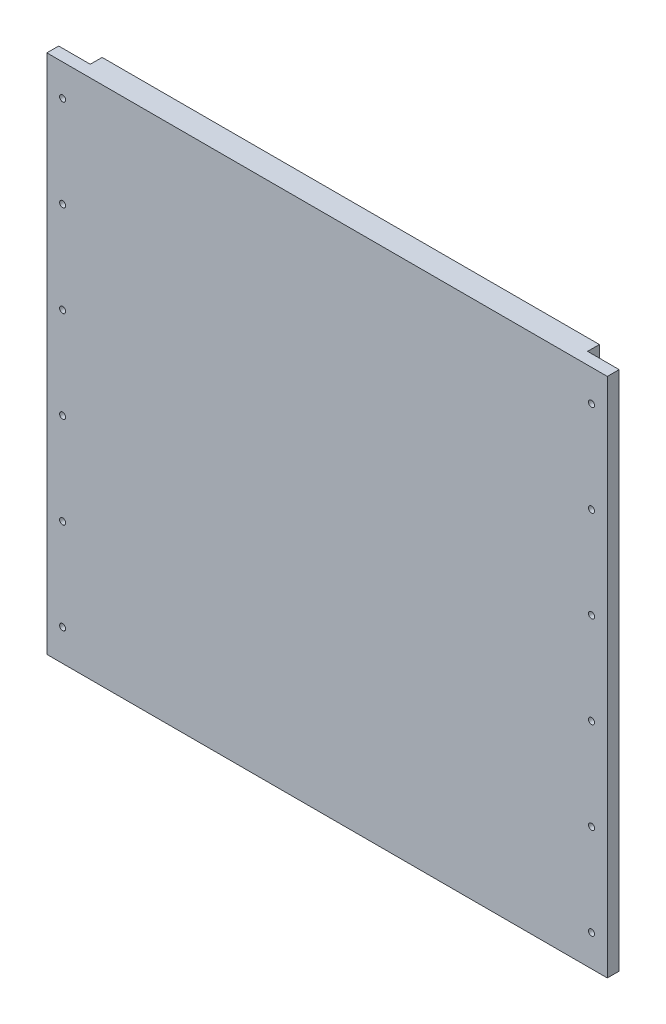
ISO-10303-21;
HEADER;
FILE_DESCRIPTION(('STEP AP214'),'2;1');
FILE_NAME('part.step','',(''),(''),'','','');
FILE_SCHEMA(('AUTOMOTIVE_DESIGN { 1 0 10303 214 1 1 1 1 }'));
ENDSEC;
DATA;
#1=APPLICATION_CONTEXT('core data for automotive mechanical design processes');
#2=APPLICATION_PROTOCOL_DEFINITION('international standard','automotive_design',2000,#1);
#3=PRODUCT_CONTEXT('',#1,'mechanical');
#4=PRODUCT('Part','Part','',(#3));
#5=PRODUCT_RELATED_PRODUCT_CATEGORY('part','',(#4));
#6=PRODUCT_DEFINITION_FORMATION('','',#4);
#7=PRODUCT_DEFINITION_CONTEXT('part definition',#1,'design');
#8=PRODUCT_DEFINITION('design','',#6,#7);
#9=PRODUCT_DEFINITION_SHAPE('','',#8);
#10=(LENGTH_UNIT() NAMED_UNIT(*) SI_UNIT(.MILLI.,.METRE.));
#11=(NAMED_UNIT(*) PLANE_ANGLE_UNIT() SI_UNIT($,.RADIAN.));
#12=(NAMED_UNIT(*) SI_UNIT($,.STERADIAN.) SOLID_ANGLE_UNIT());
#13=UNCERTAINTY_MEASURE_WITH_UNIT(LENGTH_MEASURE(1.E-05),#10,'distance_accuracy_value','');
#14=(GEOMETRIC_REPRESENTATION_CONTEXT(3) GLOBAL_UNCERTAINTY_ASSIGNED_CONTEXT((#13)) GLOBAL_UNIT_ASSIGNED_CONTEXT((#10,
#11,#12)) REPRESENTATION_CONTEXT('',''));
#15=CARTESIAN_POINT('',(0.,0.,0.));
#16=DIRECTION('',(0.,0.,1.));
#17=DIRECTION('',(1.,0.,0.));
#18=AXIS2_PLACEMENT_3D('',#15,#16,#17);
#19=CARTESIAN_POINT('',(-17.1701871411068,419.1,-1.02027368141359));
#20=DIRECTION('',(1.,0.,0.));
#21=DIRECTION('',(0.,0.,-1.));
#22=AXIS2_PLACEMENT_3D('',#19,#20,#21);
#23=PLANE('',#22);
#24=DIRECTION('',(0.,0.,1.));
#25=VECTOR('',#24,1.);
#26=CARTESIAN_POINT('',(-17.1701871411068,0.,-1.02027368141359));
#27=LINE('',#26,#25);
#28=CARTESIAN_POINT('',(-17.1701871411068,0.,-1.02027368141359));
#29=VERTEX_POINT('',#28);
#30=CARTESIAN_POINT('',(-17.1701871411068,0.,8.50472631858641));
#31=VERTEX_POINT('',#30);
#32=EDGE_CURVE('E131',#29,#31,#27,.T.);
#33=ORIENTED_EDGE('',*,*,#32,.T.);
#34=DIRECTION('',(0.,-1.,0.));
#35=VECTOR('',#34,1.);
#36=CARTESIAN_POINT('',(-17.1701871411068,419.1,8.50472631858641));
#37=LINE('',#36,#35);
#38=CARTESIAN_POINT('',(-17.1701871411068,419.1,8.50472631858641));
#39=VERTEX_POINT('',#38);
#40=EDGE_CURVE('E11',#39,#31,#37,.T.);
#41=ORIENTED_EDGE('',*,*,#40,.F.);
#42=DIRECTION('',(0.,0.,1.));
#43=VECTOR('',#42,1.);
#44=CARTESIAN_POINT('',(-17.1701871411068,419.1,-1.02027368141359));
#45=LINE('',#44,#43);
#46=CARTESIAN_POINT('',(-17.1701871411068,419.1,-1.02027368141359));
#47=VERTEX_POINT('',#46);
#48=EDGE_CURVE('E147',#47,#39,#45,.T.);
#49=ORIENTED_EDGE('',*,*,#48,.F.);
#50=DIRECTION('',(0.,-1.,0.));
#51=VECTOR('',#50,1.);
#52=CARTESIAN_POINT('',(-17.1701871411068,419.1,-1.02027368141359));
#53=LINE('',#52,#51);
#54=EDGE_CURVE('E127',#47,#29,#53,.T.);
#55=ORIENTED_EDGE('',*,*,#54,.T.);
#56=EDGE_LOOP('',(#33,#41,#49,#55));
#57=FACE_BOUND('',#56,.T.);
#58=ADVANCED_FACE('F33',(#57),#23,.F.);
#59=CARTESIAN_POINT('',(-17.1701871411068,419.1,8.50472631858641));
#60=DIRECTION('',(0.,0.,1.));
#61=DIRECTION('',(1.,0.,0.));
#62=AXIS2_PLACEMENT_3D('',#59,#60,#61);
#63=PLANE('',#62);
#64=CARTESIAN_POINT('',(-29.8701871411068,393.7,8.50472631858642));
#65=DIRECTION('',(0.,0.,1.));
#66=DIRECTION('',(1.,0.,0.));
#67=AXIS2_PLACEMENT_3D('',#64,#65,#66);
#68=CIRCLE('',#67,2.45744999999999);
#69=CARTESIAN_POINT('',(-27.4127371411068,393.7,8.50472631858642));
#70=VERTEX_POINT('',#69);
#71=EDGE_CURVE('E309',#70,#70,#68,.T.);
#72=ORIENTED_EDGE('',*,*,#71,.T.);
#73=EDGE_LOOP('',(#72));
#74=FACE_BOUND('',#73,.T.);
#75=CARTESIAN_POINT('',(-29.8701871411068,320.04,8.50472631858642));
#76=DIRECTION('',(0.,0.,1.));
#77=DIRECTION('',(1.,0.,0.));
#78=AXIS2_PLACEMENT_3D('',#75,#76,#77);
#79=CIRCLE('',#78,2.45744999999999);
#80=CARTESIAN_POINT('',(-27.4127371411068,320.04,8.50472631858642));
#81=VERTEX_POINT('',#80);
#82=EDGE_CURVE('E313',#81,#81,#79,.T.);
#83=ORIENTED_EDGE('',*,*,#82,.T.);
#84=EDGE_LOOP('',(#83));
#85=FACE_BOUND('',#84,.T.);
#86=CARTESIAN_POINT('',(-29.8701871411068,246.38,8.50472631858642));
#87=DIRECTION('',(0.,0.,1.));
#88=DIRECTION('',(1.,0.,0.));
#89=AXIS2_PLACEMENT_3D('',#86,#87,#88);
#90=CIRCLE('',#89,2.45744999999999);
#91=CARTESIAN_POINT('',(-27.4127371411068,246.38,8.50472631858642));
#92=VERTEX_POINT('',#91);
#93=EDGE_CURVE('E322',#92,#92,#90,.T.);
#94=ORIENTED_EDGE('',*,*,#93,.T.);
#95=EDGE_LOOP('',(#94));
#96=FACE_BOUND('',#95,.T.);
#97=CARTESIAN_POINT('',(-29.8701871411068,172.72,8.50472631858642));
#98=DIRECTION('',(0.,0.,1.));
#99=DIRECTION('',(1.,0.,0.));
#100=AXIS2_PLACEMENT_3D('',#97,#98,#99);
#101=CIRCLE('',#100,2.45744999999999);
#102=CARTESIAN_POINT('',(-27.4127371411068,172.72,8.50472631858642));
#103=VERTEX_POINT('',#102);
#104=EDGE_CURVE('E328',#103,#103,#101,.T.);
#105=ORIENTED_EDGE('',*,*,#104,.T.);
#106=EDGE_LOOP('',(#105));
#107=FACE_BOUND('',#106,.T.);
#108=CARTESIAN_POINT('',(-29.8701871411068,99.06,8.50472631858642));
#109=DIRECTION('',(0.,0.,1.));
#110=DIRECTION('',(1.,0.,0.));
#111=AXIS2_PLACEMENT_3D('',#108,#109,#110);
#112=CIRCLE('',#111,2.45744999999999);
#113=CARTESIAN_POINT('',(-27.4127371411068,99.06,8.50472631858642));
#114=VERTEX_POINT('',#113);
#115=EDGE_CURVE('E334',#114,#114,#112,.T.);
#116=ORIENTED_EDGE('',*,*,#115,.T.);
#117=EDGE_LOOP('',(#116));
#118=FACE_BOUND('',#117,.T.);
#119=CARTESIAN_POINT('',(-29.8701871411068,25.4,8.50472631858642));
#120=DIRECTION('',(0.,0.,1.));
#121=DIRECTION('',(1.,0.,0.));
#122=AXIS2_PLACEMENT_3D('',#119,#120,#121);
#123=CIRCLE('',#122,2.45744999999999);
#124=CARTESIAN_POINT('',(-27.4127371411068,25.4,8.50472631858642));
#125=VERTEX_POINT('',#124);
#126=EDGE_CURVE('E340',#125,#125,#123,.T.);
#127=ORIENTED_EDGE('',*,*,#126,.T.);
#128=EDGE_LOOP('',(#127));
#129=FACE_BOUND('',#128,.T.);
#130=DIRECTION('',(-1.,0.,0.));
#131=VECTOR('',#130,1.);
#132=CARTESIAN_POINT('',(-17.1701871411068,0.,8.50472631858641));
#133=LINE('',#132,#131);
#134=CARTESIAN_POINT('',(-42.5701871411068,0.,8.50472631858642));
#135=VERTEX_POINT('',#134);
#136=EDGE_CURVE('E134',#31,#135,#133,.T.);
#137=ORIENTED_EDGE('',*,*,#136,.T.);
#138=DIRECTION('',(0.,-1.,0.));
#139=VECTOR('',#138,1.);
#140=CARTESIAN_POINT('',(-42.5701871411068,419.1,8.50472631858642));
#141=LINE('',#140,#139);
#142=CARTESIAN_POINT('',(-42.5701871411068,419.1,8.50472631858642));
#143=VERTEX_POINT('',#142);
#144=EDGE_CURVE('E42',#143,#135,#141,.T.);
#145=ORIENTED_EDGE('',*,*,#144,.F.);
#146=DIRECTION('',(-1.,0.,0.));
#147=VECTOR('',#146,1.);
#148=CARTESIAN_POINT('',(-17.1701871411068,419.1,8.50472631858641));
#149=LINE('',#148,#147);
#150=EDGE_CURVE('E94',#39,#143,#149,.T.);
#151=ORIENTED_EDGE('',*,*,#150,.F.);
#152=ORIENTED_EDGE('',*,*,#40,.T.);
#153=EDGE_LOOP('',(#137,#145,#151,#152));
#154=FACE_BOUND('',#153,.T.);
#155=ADVANCED_FACE('F215',(#74,#85,#96,#107,#118,#129,#154),#63,.F.);
#156=CARTESIAN_POINT('',(-42.5701871411068,419.1,8.50472631858642));
#157=DIRECTION('',(1.,0.,0.));
#158=DIRECTION('',(0.,0.,-1.));
#159=AXIS2_PLACEMENT_3D('',#156,#157,#158);
#160=PLANE('',#159);
#161=DIRECTION('',(0.,0.,1.));
#162=VECTOR('',#161,1.);
#163=CARTESIAN_POINT('',(-42.5701871411068,0.,8.50472631858642));
#164=LINE('',#163,#162);
#165=CARTESIAN_POINT('',(-42.5701871411068,0.,18.0297263185864));
#166=VERTEX_POINT('',#165);
#167=EDGE_CURVE('E137',#135,#166,#164,.T.);
#168=ORIENTED_EDGE('',*,*,#167,.T.);
#169=DIRECTION('',(0.,-1.,0.));
#170=VECTOR('',#169,1.);
#171=CARTESIAN_POINT('',(-42.5701871411068,419.1,18.0297263185864));
#172=LINE('',#171,#170);
#173=CARTESIAN_POINT('',(-42.5701871411068,419.1,18.0297263185864));
#174=VERTEX_POINT('',#173);
#175=EDGE_CURVE('E154',#174,#166,#172,.T.);
#176=ORIENTED_EDGE('',*,*,#175,.F.);
#177=DIRECTION('',(0.,0.,1.));
#178=VECTOR('',#177,1.);
#179=CARTESIAN_POINT('',(-42.5701871411068,419.1,8.50472631858642));
#180=LINE('',#179,#178);
#181=EDGE_CURVE('E185',#143,#174,#180,.T.);
#182=ORIENTED_EDGE('',*,*,#181,.F.);
#183=ORIENTED_EDGE('',*,*,#144,.T.);
#184=EDGE_LOOP('',(#168,#176,#182,#183));
#185=FACE_BOUND('',#184,.T.);
#186=ADVANCED_FACE('F219',(#185),#160,.F.);
#187=CARTESIAN_POINT('',(382.879812858893,419.1,18.0297263185864));
#188=DIRECTION('',(0.,0.,-1.));
#189=DIRECTION('',(-1.,0.,0.));
#190=AXIS2_PLACEMENT_3D('',#187,#188,#189);
#191=PLANE('',#190);
#192=CARTESIAN_POINT('',(-29.8701871411068,393.7,18.0297263185864));
#193=DIRECTION('',(0.,0.,1.));
#194=DIRECTION('',(1.,0.,0.));
#195=AXIS2_PLACEMENT_3D('',#192,#193,#194);
#196=CIRCLE('',#195,2.45744999999999);
#197=CARTESIAN_POINT('',(-27.4127371411068,393.7,18.0297263185864));
#198=VERTEX_POINT('',#197);
#199=EDGE_CURVE('E307',#198,#198,#196,.T.);
#200=ORIENTED_EDGE('',*,*,#199,.F.);
#201=EDGE_LOOP('',(#200));
#202=FACE_BOUND('',#201,.T.);
#203=CARTESIAN_POINT('',(-29.8701871411068,320.04,18.0297263185864));
#204=DIRECTION('',(0.,0.,1.));
#205=DIRECTION('',(1.,0.,0.));
#206=AXIS2_PLACEMENT_3D('',#203,#204,#205);
#207=CIRCLE('',#206,2.45744999999999);
#208=CARTESIAN_POINT('',(-27.4127371411068,320.04,18.0297263185864));
#209=VERTEX_POINT('',#208);
#210=EDGE_CURVE('E310',#209,#209,#207,.T.);
#211=ORIENTED_EDGE('',*,*,#210,.F.);
#212=EDGE_LOOP('',(#211));
#213=FACE_BOUND('',#212,.T.);
#214=CARTESIAN_POINT('',(-29.8701871411068,246.38,18.0297263185864));
#215=DIRECTION('',(0.,0.,1.));
#216=DIRECTION('',(1.,0.,0.));
#217=AXIS2_PLACEMENT_3D('',#214,#215,#216);
#218=CIRCLE('',#217,2.45744999999999);
#219=CARTESIAN_POINT('',(-27.4127371411068,246.38,18.0297263185864));
#220=VERTEX_POINT('',#219);
#221=EDGE_CURVE('E319',#220,#220,#218,.T.);
#222=ORIENTED_EDGE('',*,*,#221,.F.);
#223=EDGE_LOOP('',(#222));
#224=FACE_BOUND('',#223,.T.);
#225=CARTESIAN_POINT('',(-29.8701871411068,172.72,18.0297263185864));
#226=DIRECTION('',(0.,0.,1.));
#227=DIRECTION('',(1.,0.,0.));
#228=AXIS2_PLACEMENT_3D('',#225,#226,#227);
#229=CIRCLE('',#228,2.45744999999999);
#230=CARTESIAN_POINT('',(-27.4127371411068,172.72,18.0297263185864));
#231=VERTEX_POINT('',#230);
#232=EDGE_CURVE('E325',#231,#231,#229,.T.);
#233=ORIENTED_EDGE('',*,*,#232,.F.);
#234=EDGE_LOOP('',(#233));
#235=FACE_BOUND('',#234,.T.);
#236=CARTESIAN_POINT('',(-29.8701871411068,99.06,18.0297263185864));
#237=DIRECTION('',(0.,0.,1.));
#238=DIRECTION('',(1.,0.,0.));
#239=AXIS2_PLACEMENT_3D('',#236,#237,#238);
#240=CIRCLE('',#239,2.45744999999999);
#241=CARTESIAN_POINT('',(-27.4127371411068,99.06,18.0297263185864));
#242=VERTEX_POINT('',#241);
#243=EDGE_CURVE('E331',#242,#242,#240,.T.);
#244=ORIENTED_EDGE('',*,*,#243,.F.);
#245=EDGE_LOOP('',(#244));
#246=FACE_BOUND('',#245,.T.);
#247=CARTESIAN_POINT('',(-29.8701871411068,25.4,18.0297263185864));
#248=DIRECTION('',(0.,0.,1.));
#249=DIRECTION('',(1.,0.,0.));
#250=AXIS2_PLACEMENT_3D('',#247,#248,#249);
#251=CIRCLE('',#250,2.45744999999999);
#252=CARTESIAN_POINT('',(-27.4127371411068,25.4,18.0297263185864));
#253=VERTEX_POINT('',#252);
#254=EDGE_CURVE('E337',#253,#253,#251,.T.);
#255=ORIENTED_EDGE('',*,*,#254,.F.);
#256=EDGE_LOOP('',(#255));
#257=FACE_BOUND('',#256,.T.);
#258=CARTESIAN_POINT('',(395.579812858893,25.4,18.0297263185864));
#259=DIRECTION('',(0.,0.,1.));
#260=DIRECTION('',(1.,0.,0.));
#261=AXIS2_PLACEMENT_3D('',#258,#259,#260);
#262=CIRCLE('',#261,2.45744999999997);
#263=CARTESIAN_POINT('',(398.037262858893,25.4,18.0297263185864));
#264=VERTEX_POINT('',#263);
#265=EDGE_CURVE('E343',#264,#264,#262,.T.);
#266=ORIENTED_EDGE('',*,*,#265,.F.);
#267=EDGE_LOOP('',(#266));
#268=FACE_BOUND('',#267,.T.);
#269=CARTESIAN_POINT('',(395.579812858893,99.06,18.0297263185864));
#270=DIRECTION('',(0.,0.,1.));
#271=DIRECTION('',(1.,0.,0.));
#272=AXIS2_PLACEMENT_3D('',#269,#270,#271);
#273=CIRCLE('',#272,2.45744999999997);
#274=CARTESIAN_POINT('',(398.037262858893,99.06,18.0297263185864));
#275=VERTEX_POINT('',#274);
#276=EDGE_CURVE('E347',#275,#275,#273,.T.);
#277=ORIENTED_EDGE('',*,*,#276,.F.);
#278=EDGE_LOOP('',(#277));
#279=FACE_BOUND('',#278,.T.);
#280=CARTESIAN_POINT('',(395.579812858893,172.72,18.0297263185864));
#281=DIRECTION('',(0.,0.,1.));
#282=DIRECTION('',(1.,0.,0.));
#283=AXIS2_PLACEMENT_3D('',#280,#281,#282);
#284=CIRCLE('',#283,2.45744999999997);
#285=CARTESIAN_POINT('',(398.037262858893,172.72,18.0297263185864));
#286=VERTEX_POINT('',#285);
#287=EDGE_CURVE('E177',#286,#286,#284,.T.);
#288=ORIENTED_EDGE('',*,*,#287,.F.);
#289=EDGE_LOOP('',(#288));
#290=FACE_BOUND('',#289,.T.);
#291=CARTESIAN_POINT('',(395.579812858893,246.38,18.0297263185864));
#292=DIRECTION('',(0.,0.,1.));
#293=DIRECTION('',(1.,0.,0.));
#294=AXIS2_PLACEMENT_3D('',#291,#292,#293);
#295=CIRCLE('',#294,2.45744999999997);
#296=CARTESIAN_POINT('',(398.037262858893,246.38,18.0297263185864));
#297=VERTEX_POINT('',#296);
#298=EDGE_CURVE('E167',#297,#297,#295,.T.);
#299=ORIENTED_EDGE('',*,*,#298,.F.);
#300=EDGE_LOOP('',(#299));
#301=FACE_BOUND('',#300,.T.);
#302=CARTESIAN_POINT('',(395.579812858893,320.04,18.0297263185864));
#303=DIRECTION('',(0.,0.,1.));
#304=DIRECTION('',(1.,0.,0.));
#305=AXIS2_PLACEMENT_3D('',#302,#303,#304);
#306=CIRCLE('',#305,2.45744999999997);
#307=CARTESIAN_POINT('',(398.037262858893,320.04,18.0297263185864));
#308=VERTEX_POINT('',#307);
#309=EDGE_CURVE('E164',#308,#308,#306,.T.);
#310=ORIENTED_EDGE('',*,*,#309,.F.);
#311=EDGE_LOOP('',(#310));
#312=FACE_BOUND('',#311,.T.);
#313=CARTESIAN_POINT('',(395.579812858893,393.7,18.0297263185864));
#314=DIRECTION('',(0.,0.,1.));
#315=DIRECTION('',(1.,0.,0.));
#316=AXIS2_PLACEMENT_3D('',#313,#314,#315);
#317=CIRCLE('',#316,2.45744999999997);
#318=CARTESIAN_POINT('',(398.037262858893,393.7,18.0297263185864));
#319=VERTEX_POINT('',#318);
#320=EDGE_CURVE('E161',#319,#319,#317,.T.);
#321=ORIENTED_EDGE('',*,*,#320,.F.);
#322=EDGE_LOOP('',(#321));
#323=FACE_BOUND('',#322,.T.);
#324=DIRECTION('',(1.,0.,0.));
#325=VECTOR('',#324,1.);
#326=CARTESIAN_POINT('',(382.879812858893,0.,18.0297263185864));
#327=LINE('',#326,#325);
#328=CARTESIAN_POINT('',(408.279812858893,0.,18.0297263185864));
#329=VERTEX_POINT('',#328);
#330=EDGE_CURVE('E140',#166,#329,#327,.T.);
#331=ORIENTED_EDGE('',*,*,#330,.T.);
#332=DIRECTION('',(0.,-1.,0.));
#333=VECTOR('',#332,1.);
#334=CARTESIAN_POINT('',(408.279812858893,419.1,18.0297263185864));
#335=LINE('',#334,#333);
#336=CARTESIAN_POINT('',(408.279812858893,419.1,18.0297263185864));
#337=VERTEX_POINT('',#336);
#338=EDGE_CURVE('E151',#337,#329,#335,.T.);
#339=ORIENTED_EDGE('',*,*,#338,.F.);
#340=DIRECTION('',(1.,0.,0.));
#341=VECTOR('',#340,1.);
#342=CARTESIAN_POINT('',(-17.1701871411068,419.1,18.0297263185864));
#343=LINE('',#342,#341);
#344=EDGE_CURVE('E187',#174,#337,#343,.T.);
#345=ORIENTED_EDGE('',*,*,#344,.F.);
#346=ORIENTED_EDGE('',*,*,#175,.T.);
#347=EDGE_LOOP('',(#331,#339,#345,#346));
#348=FACE_BOUND('',#347,.T.);
#349=ADVANCED_FACE('F193',(#202,#213,#224,#235,#246,#257,#268,#279,#290,#301,#312,#323,#348),
#191,.F.);
#350=CARTESIAN_POINT('',(408.279812858893,419.1,8.50472631858641));
#351=DIRECTION('',(-1.,0.,0.));
#352=DIRECTION('',(0.,0.,1.));
#353=AXIS2_PLACEMENT_3D('',#350,#351,#352);
#354=PLANE('',#353);
#355=DIRECTION('',(0.,0.,-1.));
#356=VECTOR('',#355,1.);
#357=CARTESIAN_POINT('',(408.279812858893,0.,8.50472631858641));
#358=LINE('',#357,#356);
#359=CARTESIAN_POINT('',(408.279812858893,0.,8.50472631858641));
#360=VERTEX_POINT('',#359);
#361=EDGE_CURVE('E142',#329,#360,#358,.T.);
#362=ORIENTED_EDGE('',*,*,#361,.T.);
#363=DIRECTION('',(0.,-1.,0.));
#364=VECTOR('',#363,1.);
#365=CARTESIAN_POINT('',(408.279812858893,419.1,8.50472631858641));
#366=LINE('',#365,#364);
#367=CARTESIAN_POINT('',(408.279812858893,419.1,8.50472631858641));
#368=VERTEX_POINT('',#367);
#369=EDGE_CURVE('E122',#368,#360,#366,.T.);
#370=ORIENTED_EDGE('',*,*,#369,.F.);
#371=DIRECTION('',(0.,0.,-1.));
#372=VECTOR('',#371,1.);
#373=CARTESIAN_POINT('',(408.279812858893,419.1,8.50472631858641));
#374=LINE('',#373,#372);
#375=EDGE_CURVE('E113',#337,#368,#374,.T.);
#376=ORIENTED_EDGE('',*,*,#375,.F.);
#377=ORIENTED_EDGE('',*,*,#338,.T.);
#378=EDGE_LOOP('',(#362,#370,#376,#377));
#379=FACE_BOUND('',#378,.T.);
#380=ADVANCED_FACE('F196',(#379),#354,.F.);
#381=CARTESIAN_POINT('',(382.879812858893,419.1,8.50472631858642));
#382=DIRECTION('',(0.,0.,1.));
#383=DIRECTION('',(1.,0.,0.));
#384=AXIS2_PLACEMENT_3D('',#381,#382,#383);
#385=PLANE('',#384);
#386=CARTESIAN_POINT('',(395.579812858893,25.4,8.50472631858641));
#387=DIRECTION('',(0.,0.,1.));
#388=DIRECTION('',(1.,0.,0.));
#389=AXIS2_PLACEMENT_3D('',#386,#387,#388);
#390=CIRCLE('',#389,2.45744999999997);
#391=CARTESIAN_POINT('',(398.037262858893,25.4,8.50472631858641));
#392=VERTEX_POINT('',#391);
#393=EDGE_CURVE('E241',#392,#392,#390,.T.);
#394=ORIENTED_EDGE('',*,*,#393,.T.);
#395=EDGE_LOOP('',(#394));
#396=FACE_BOUND('',#395,.T.);
#397=CARTESIAN_POINT('',(395.579812858893,99.06,8.50472631858641));
#398=DIRECTION('',(0.,0.,1.));
#399=DIRECTION('',(1.,0.,0.));
#400=AXIS2_PLACEMENT_3D('',#397,#398,#399);
#401=CIRCLE('',#400,2.45744999999997);
#402=CARTESIAN_POINT('',(398.037262858893,99.06,8.50472631858641));
#403=VERTEX_POINT('',#402);
#404=EDGE_CURVE('E245',#403,#403,#401,.T.);
#405=ORIENTED_EDGE('',*,*,#404,.T.);
#406=EDGE_LOOP('',(#405));
#407=FACE_BOUND('',#406,.T.);
#408=CARTESIAN_POINT('',(395.579812858893,172.72,8.50472631858641));
#409=DIRECTION('',(0.,0.,1.));
#410=DIRECTION('',(1.,0.,0.));
#411=AXIS2_PLACEMENT_3D('',#408,#409,#410);
#412=CIRCLE('',#411,2.45744999999997);
#413=CARTESIAN_POINT('',(398.037262858893,172.72,8.50472631858641));
#414=VERTEX_POINT('',#413);
#415=EDGE_CURVE('E36',#414,#414,#412,.T.);
#416=ORIENTED_EDGE('',*,*,#415,.T.);
#417=EDGE_LOOP('',(#416));
#418=FACE_BOUND('',#417,.T.);
#419=CARTESIAN_POINT('',(395.579812858893,246.38,8.50472631858641));
#420=DIRECTION('',(0.,0.,1.));
#421=DIRECTION('',(1.,0.,0.));
#422=AXIS2_PLACEMENT_3D('',#419,#420,#421);
#423=CIRCLE('',#422,2.45744999999997);
#424=CARTESIAN_POINT('',(398.037262858893,246.38,8.50472631858641));
#425=VERTEX_POINT('',#424);
#426=EDGE_CURVE('E165',#425,#425,#423,.T.);
#427=ORIENTED_EDGE('',*,*,#426,.T.);
#428=EDGE_LOOP('',(#427));
#429=FACE_BOUND('',#428,.T.);
#430=CARTESIAN_POINT('',(395.579812858893,320.04,8.50472631858641));
#431=DIRECTION('',(0.,0.,1.));
#432=DIRECTION('',(1.,0.,0.));
#433=AXIS2_PLACEMENT_3D('',#430,#431,#432);
#434=CIRCLE('',#433,2.45744999999997);
#435=CARTESIAN_POINT('',(398.037262858893,320.04,8.50472631858641));
#436=VERTEX_POINT('',#435);
#437=EDGE_CURVE('E162',#436,#436,#434,.T.);
#438=ORIENTED_EDGE('',*,*,#437,.T.);
#439=EDGE_LOOP('',(#438));
#440=FACE_BOUND('',#439,.T.);
#441=CARTESIAN_POINT('',(395.579812858893,393.7,8.50472631858641));
#442=DIRECTION('',(0.,0.,1.));
#443=DIRECTION('',(1.,0.,0.));
#444=AXIS2_PLACEMENT_3D('',#441,#442,#443);
#445=CIRCLE('',#444,2.45744999999997);
#446=CARTESIAN_POINT('',(398.037262858893,393.7,8.50472631858641));
#447=VERTEX_POINT('',#446);
#448=EDGE_CURVE('E135',#447,#447,#445,.T.);
#449=ORIENTED_EDGE('',*,*,#448,.T.);
#450=EDGE_LOOP('',(#449));
#451=FACE_BOUND('',#450,.T.);
#452=DIRECTION('',(-1.,0.,0.));
#453=VECTOR('',#452,1.);
#454=CARTESIAN_POINT('',(382.879812858893,0.,8.50472631858642));
#455=LINE('',#454,#453);
#456=CARTESIAN_POINT('',(382.879812858893,0.,8.50472631858642));
#457=VERTEX_POINT('',#456);
#458=EDGE_CURVE('E121',#360,#457,#455,.T.);
#459=ORIENTED_EDGE('',*,*,#458,.T.);
#460=DIRECTION('',(0.,-1.,0.));
#461=VECTOR('',#460,1.);
#462=CARTESIAN_POINT('',(382.879812858893,419.1,8.50472631858642));
#463=LINE('',#462,#461);
#464=CARTESIAN_POINT('',(382.879812858893,419.1,8.50472631858642));
#465=VERTEX_POINT('',#464);
#466=EDGE_CURVE('E118',#465,#457,#463,.T.);
#467=ORIENTED_EDGE('',*,*,#466,.F.);
#468=DIRECTION('',(-1.,0.,0.));
#469=VECTOR('',#468,1.);
#470=CARTESIAN_POINT('',(382.879812858893,419.1,8.50472631858642));
#471=LINE('',#470,#469);
#472=EDGE_CURVE('E107',#368,#465,#471,.T.);
#473=ORIENTED_EDGE('',*,*,#472,.F.);
#474=ORIENTED_EDGE('',*,*,#369,.T.);
#475=EDGE_LOOP('',(#459,#467,#473,#474));
#476=FACE_BOUND('',#475,.T.);
#477=ADVANCED_FACE('F119',(#396,#407,#418,#429,#440,#451,#476),#385,.F.);
#478=CARTESIAN_POINT('',(382.879812858893,419.1,-1.02027368141359));
#479=DIRECTION('',(-1.,0.,0.));
#480=DIRECTION('',(0.,0.,1.));
#481=AXIS2_PLACEMENT_3D('',#478,#479,#480);
#482=PLANE('',#481);
#483=DIRECTION('',(0.,0.,-1.));
#484=VECTOR('',#483,1.);
#485=CARTESIAN_POINT('',(382.879812858893,0.,-1.02027368141359));
#486=LINE('',#485,#484);
#487=CARTESIAN_POINT('',(382.879812858893,0.,-1.02027368141359));
#488=VERTEX_POINT('',#487);
#489=EDGE_CURVE('E80',#457,#488,#486,.T.);
#490=ORIENTED_EDGE('',*,*,#489,.T.);
#491=DIRECTION('',(0.,-1.,0.));
#492=VECTOR('',#491,1.);
#493=CARTESIAN_POINT('',(382.879812858893,419.1,-1.02027368141359));
#494=LINE('',#493,#492);
#495=CARTESIAN_POINT('',(382.879812858893,419.1,-1.02027368141359));
#496=VERTEX_POINT('',#495);
#497=EDGE_CURVE('E123',#496,#488,#494,.T.);
#498=ORIENTED_EDGE('',*,*,#497,.F.);
#499=DIRECTION('',(0.,0.,-1.));
#500=VECTOR('',#499,1.);
#501=CARTESIAN_POINT('',(382.879812858893,419.1,-1.02027368141359));
#502=LINE('',#501,#500);
#503=EDGE_CURVE('E111',#465,#496,#502,.T.);
#504=ORIENTED_EDGE('',*,*,#503,.F.);
#505=ORIENTED_EDGE('',*,*,#466,.T.);
#506=EDGE_LOOP('',(#490,#498,#504,#505));
#507=FACE_BOUND('',#506,.T.);
#508=ADVANCED_FACE('F125',(#507),#482,.F.);
#509=CARTESIAN_POINT('',(-17.1701871411068,419.1,-1.02027368141359));
#510=DIRECTION('',(0.,0.,1.));
#511=DIRECTION('',(1.,0.,0.));
#512=AXIS2_PLACEMENT_3D('',#509,#510,#511);
#513=PLANE('',#512);
#514=DIRECTION('',(-1.,0.,0.));
#515=VECTOR('',#514,1.);
#516=CARTESIAN_POINT('',(-17.1701871411068,0.,-1.02027368141359));
#517=LINE('',#516,#515);
#518=EDGE_CURVE('E86',#488,#29,#517,.T.);
#519=ORIENTED_EDGE('',*,*,#518,.T.);
#520=ORIENTED_EDGE('',*,*,#54,.F.);
#521=DIRECTION('',(-1.,0.,0.));
#522=VECTOR('',#521,1.);
#523=CARTESIAN_POINT('',(-17.1701871411068,419.1,-1.02027368141359));
#524=LINE('',#523,#522);
#525=EDGE_CURVE('E51',#496,#47,#524,.T.);
#526=ORIENTED_EDGE('',*,*,#525,.F.);
#527=ORIENTED_EDGE('',*,*,#497,.T.);
#528=EDGE_LOOP('',(#519,#520,#526,#527));
#529=FACE_BOUND('',#528,.T.);
#530=ADVANCED_FACE('F204',(#529),#513,.F.);
#531=CARTESIAN_POINT('',(0.,419.1,0.));
#532=DIRECTION('',(0.,-1.,0.));
#533=DIRECTION('',(0.,0.,-1.));
#534=AXIS2_PLACEMENT_3D('',#531,#532,#533);
#535=PLANE('',#534);
#536=ORIENTED_EDGE('',*,*,#48,.T.);
#537=ORIENTED_EDGE('',*,*,#150,.T.);
#538=ORIENTED_EDGE('',*,*,#181,.T.);
#539=ORIENTED_EDGE('',*,*,#344,.T.);
#540=ORIENTED_EDGE('',*,*,#375,.T.);
#541=ORIENTED_EDGE('',*,*,#472,.T.);
#542=ORIENTED_EDGE('',*,*,#503,.T.);
#543=ORIENTED_EDGE('',*,*,#525,.T.);
#544=EDGE_LOOP('',(#536,#537,#538,#539,#540,#541,#542,#543));
#545=FACE_BOUND('',#544,.T.);
#546=ADVANCED_FACE('F109',(#545),#535,.F.);
#547=CARTESIAN_POINT('',(0.,0.,0.));
#548=DIRECTION('',(0.,-1.,0.));
#549=DIRECTION('',(0.,0.,-1.));
#550=AXIS2_PLACEMENT_3D('',#547,#548,#549);
#551=PLANE('',#550);
#552=ORIENTED_EDGE('',*,*,#32,.F.);
#553=ORIENTED_EDGE('',*,*,#518,.F.);
#554=ORIENTED_EDGE('',*,*,#489,.F.);
#555=ORIENTED_EDGE('',*,*,#458,.F.);
#556=ORIENTED_EDGE('',*,*,#361,.F.);
#557=ORIENTED_EDGE('',*,*,#330,.F.);
#558=ORIENTED_EDGE('',*,*,#167,.F.);
#559=ORIENTED_EDGE('',*,*,#136,.F.);
#560=EDGE_LOOP('',(#552,#553,#554,#555,#556,#557,#558,#559));
#561=FACE_BOUND('',#560,.T.);
#562=ADVANCED_FACE('F199',(#561),#551,.T.);
#563=CARTESIAN_POINT('',(395.579812858893,393.7,18.0297263185864));
#564=DIRECTION('',(0.,0.,1.));
#565=DIRECTION('',(1.,0.,0.));
#566=AXIS2_PLACEMENT_3D('',#563,#564,#565);
#567=CYLINDRICAL_SURFACE('',#566,2.45744999999997);
#568=ORIENTED_EDGE('',*,*,#320,.T.);
#569=EDGE_LOOP('',(#568));
#570=FACE_BOUND('',#569,.T.);
#571=ORIENTED_EDGE('',*,*,#448,.F.);
#572=EDGE_LOOP('',(#571));
#573=FACE_BOUND('',#572,.T.);
#574=ADVANCED_FACE('F252',(#570,#573),#567,.F.);
#575=CARTESIAN_POINT('',(395.579812858893,320.04,18.0297263185864));
#576=DIRECTION('',(0.,0.,1.));
#577=DIRECTION('',(1.,0.,0.));
#578=AXIS2_PLACEMENT_3D('',#575,#576,#577);
#579=CYLINDRICAL_SURFACE('',#578,2.45744999999997);
#580=ORIENTED_EDGE('',*,*,#309,.T.);
#581=EDGE_LOOP('',(#580));
#582=FACE_BOUND('',#581,.T.);
#583=ORIENTED_EDGE('',*,*,#437,.F.);
#584=EDGE_LOOP('',(#583));
#585=FACE_BOUND('',#584,.T.);
#586=ADVANCED_FACE('F254',(#582,#585),#579,.F.);
#587=CARTESIAN_POINT('',(395.579812858893,246.38,18.0297263185864));
#588=DIRECTION('',(0.,0.,1.));
#589=DIRECTION('',(1.,0.,0.));
#590=AXIS2_PLACEMENT_3D('',#587,#588,#589);
#591=CYLINDRICAL_SURFACE('',#590,2.45744999999997);
#592=ORIENTED_EDGE('',*,*,#298,.T.);
#593=EDGE_LOOP('',(#592));
#594=FACE_BOUND('',#593,.T.);
#595=ORIENTED_EDGE('',*,*,#426,.F.);
#596=EDGE_LOOP('',(#595));
#597=FACE_BOUND('',#596,.T.);
#598=ADVANCED_FACE('F261',(#594,#597),#591,.F.);
#599=CARTESIAN_POINT('',(395.579812858893,172.72,18.0297263185864));
#600=DIRECTION('',(0.,0.,1.));
#601=DIRECTION('',(1.,0.,0.));
#602=AXIS2_PLACEMENT_3D('',#599,#600,#601);
#603=CYLINDRICAL_SURFACE('',#602,2.45744999999997);
#604=ORIENTED_EDGE('',*,*,#287,.T.);
#605=EDGE_LOOP('',(#604));
#606=FACE_BOUND('',#605,.T.);
#607=ORIENTED_EDGE('',*,*,#415,.F.);
#608=EDGE_LOOP('',(#607));
#609=FACE_BOUND('',#608,.T.);
#610=ADVANCED_FACE('F267',(#606,#609),#603,.F.);
#611=CARTESIAN_POINT('',(395.579812858893,99.06,18.0297263185864));
#612=DIRECTION('',(0.,0.,1.));
#613=DIRECTION('',(1.,0.,0.));
#614=AXIS2_PLACEMENT_3D('',#611,#612,#613);
#615=CYLINDRICAL_SURFACE('',#614,2.45744999999997);
#616=ORIENTED_EDGE('',*,*,#276,.T.);
#617=EDGE_LOOP('',(#616));
#618=FACE_BOUND('',#617,.T.);
#619=ORIENTED_EDGE('',*,*,#404,.F.);
#620=EDGE_LOOP('',(#619));
#621=FACE_BOUND('',#620,.T.);
#622=ADVANCED_FACE('F270',(#618,#621),#615,.F.);
#623=CARTESIAN_POINT('',(395.579812858893,25.4,18.0297263185864));
#624=DIRECTION('',(0.,0.,1.));
#625=DIRECTION('',(1.,0.,0.));
#626=AXIS2_PLACEMENT_3D('',#623,#624,#625);
#627=CYLINDRICAL_SURFACE('',#626,2.45744999999997);
#628=ORIENTED_EDGE('',*,*,#265,.T.);
#629=EDGE_LOOP('',(#628));
#630=FACE_BOUND('',#629,.T.);
#631=ORIENTED_EDGE('',*,*,#393,.F.);
#632=EDGE_LOOP('',(#631));
#633=FACE_BOUND('',#632,.T.);
#634=ADVANCED_FACE('F274',(#630,#633),#627,.F.);
#635=CARTESIAN_POINT('',(-29.8701871411068,25.4,18.0297263185864));
#636=DIRECTION('',(0.,0.,1.));
#637=DIRECTION('',(1.,0.,0.));
#638=AXIS2_PLACEMENT_3D('',#635,#636,#637);
#639=CYLINDRICAL_SURFACE('',#638,2.45744999999999);
#640=ORIENTED_EDGE('',*,*,#254,.T.);
#641=EDGE_LOOP('',(#640));
#642=FACE_BOUND('',#641,.T.);
#643=ORIENTED_EDGE('',*,*,#126,.F.);
#644=EDGE_LOOP('',(#643));
#645=FACE_BOUND('',#644,.T.);
#646=ADVANCED_FACE('F278',(#642,#645),#639,.F.);
#647=CARTESIAN_POINT('',(-29.8701871411068,99.06,18.0297263185864));
#648=DIRECTION('',(0.,0.,1.));
#649=DIRECTION('',(1.,0.,0.));
#650=AXIS2_PLACEMENT_3D('',#647,#648,#649);
#651=CYLINDRICAL_SURFACE('',#650,2.45744999999999);
#652=ORIENTED_EDGE('',*,*,#243,.T.);
#653=EDGE_LOOP('',(#652));
#654=FACE_BOUND('',#653,.T.);
#655=ORIENTED_EDGE('',*,*,#115,.F.);
#656=EDGE_LOOP('',(#655));
#657=FACE_BOUND('',#656,.T.);
#658=ADVANCED_FACE('F282',(#654,#657),#651,.F.);
#659=CARTESIAN_POINT('',(-29.8701871411068,172.72,18.0297263185864));
#660=DIRECTION('',(0.,0.,1.));
#661=DIRECTION('',(1.,0.,0.));
#662=AXIS2_PLACEMENT_3D('',#659,#660,#661);
#663=CYLINDRICAL_SURFACE('',#662,2.45744999999999);
#664=ORIENTED_EDGE('',*,*,#232,.T.);
#665=EDGE_LOOP('',(#664));
#666=FACE_BOUND('',#665,.T.);
#667=ORIENTED_EDGE('',*,*,#104,.F.);
#668=EDGE_LOOP('',(#667));
#669=FACE_BOUND('',#668,.T.);
#670=ADVANCED_FACE('F286',(#666,#669),#663,.F.);
#671=CARTESIAN_POINT('',(-29.8701871411068,246.38,18.0297263185864));
#672=DIRECTION('',(0.,0.,1.));
#673=DIRECTION('',(1.,0.,0.));
#674=AXIS2_PLACEMENT_3D('',#671,#672,#673);
#675=CYLINDRICAL_SURFACE('',#674,2.45744999999999);
#676=ORIENTED_EDGE('',*,*,#221,.T.);
#677=EDGE_LOOP('',(#676));
#678=FACE_BOUND('',#677,.T.);
#679=ORIENTED_EDGE('',*,*,#93,.F.);
#680=EDGE_LOOP('',(#679));
#681=FACE_BOUND('',#680,.T.);
#682=ADVANCED_FACE('F290',(#678,#681),#675,.F.);
#683=CARTESIAN_POINT('',(-29.8701871411068,320.04,18.0297263185864));
#684=DIRECTION('',(0.,0.,1.));
#685=DIRECTION('',(1.,0.,0.));
#686=AXIS2_PLACEMENT_3D('',#683,#684,#685);
#687=CYLINDRICAL_SURFACE('',#686,2.45744999999999);
#688=ORIENTED_EDGE('',*,*,#210,.T.);
#689=EDGE_LOOP('',(#688));
#690=FACE_BOUND('',#689,.T.);
#691=ORIENTED_EDGE('',*,*,#82,.F.);
#692=EDGE_LOOP('',(#691));
#693=FACE_BOUND('',#692,.T.);
#694=ADVANCED_FACE('F294',(#690,#693),#687,.F.);
#695=CARTESIAN_POINT('',(-29.8701871411068,393.7,18.0297263185864));
#696=DIRECTION('',(0.,0.,1.));
#697=DIRECTION('',(1.,0.,0.));
#698=AXIS2_PLACEMENT_3D('',#695,#696,#697);
#699=CYLINDRICAL_SURFACE('',#698,2.45744999999999);
#700=ORIENTED_EDGE('',*,*,#199,.T.);
#701=EDGE_LOOP('',(#700));
#702=FACE_BOUND('',#701,.T.);
#703=ORIENTED_EDGE('',*,*,#71,.F.);
#704=EDGE_LOOP('',(#703));
#705=FACE_BOUND('',#704,.T.);
#706=ADVANCED_FACE('F298',(#702,#705),#699,.F.);
#707=CLOSED_SHELL('',(#58,#155,#186,#349,#380,#477,#508,#530,#546,#562,#574,#586,#598,#610,#622,
#634,#646,#658,#670,#682,#694,#706));
#708=MANIFOLD_SOLID_BREP('B2',#707);
#709=ADVANCED_BREP_SHAPE_REPRESENTATION('',(#18,#708),#14);
#710=SHAPE_DEFINITION_REPRESENTATION(#9,#709);
ENDSEC;
END-ISO-10303-21;
